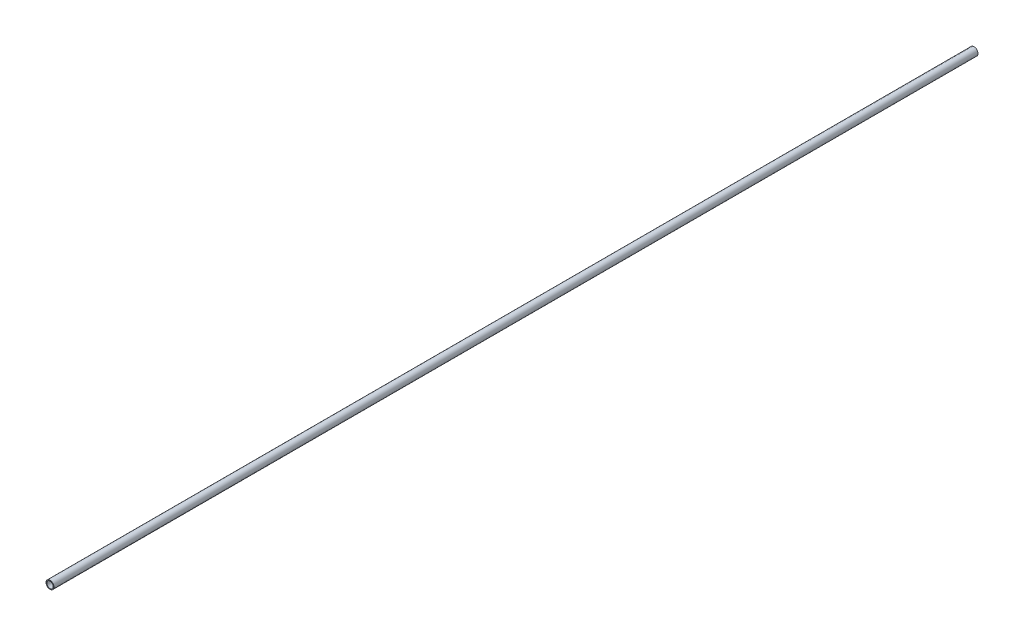
ISO-10303-21;
HEADER;
FILE_DESCRIPTION(('STEP AP214'),'2;1');
FILE_NAME('part.step','',(''),(''),'','','');
FILE_SCHEMA(('AUTOMOTIVE_DESIGN { 1 0 10303 214 1 1 1 1 }'));
ENDSEC;
DATA;
#1=APPLICATION_CONTEXT('core data for automotive mechanical design processes');
#2=APPLICATION_PROTOCOL_DEFINITION('international standard','automotive_design',2000,#1);
#3=PRODUCT_CONTEXT('',#1,'mechanical');
#4=PRODUCT('Part','Part','',(#3));
#5=PRODUCT_RELATED_PRODUCT_CATEGORY('part','',(#4));
#6=PRODUCT_DEFINITION_FORMATION('','',#4);
#7=PRODUCT_DEFINITION_CONTEXT('part definition',#1,'design');
#8=PRODUCT_DEFINITION('design','',#6,#7);
#9=PRODUCT_DEFINITION_SHAPE('','',#8);
#10=(LENGTH_UNIT() NAMED_UNIT(*) SI_UNIT(.MILLI.,.METRE.));
#11=(NAMED_UNIT(*) PLANE_ANGLE_UNIT() SI_UNIT($,.RADIAN.));
#12=(NAMED_UNIT(*) SI_UNIT($,.STERADIAN.) SOLID_ANGLE_UNIT());
#13=UNCERTAINTY_MEASURE_WITH_UNIT(LENGTH_MEASURE(1.E-05),#10,'distance_accuracy_value','');
#14=(GEOMETRIC_REPRESENTATION_CONTEXT(3) GLOBAL_UNCERTAINTY_ASSIGNED_CONTEXT((#13)) GLOBAL_UNIT_ASSIGNED_CONTEXT((#10,
#11,#12)) REPRESENTATION_CONTEXT('',''));
#15=CARTESIAN_POINT('',(0.,0.,0.));
#16=DIRECTION('',(0.,0.,1.));
#17=DIRECTION('',(1.,0.,0.));
#18=AXIS2_PLACEMENT_3D('',#15,#16,#17);
#19=CARTESIAN_POINT('',(0.,0.,1838.452));
#20=DIRECTION('',(0.,0.,1.));
#21=DIRECTION('',(1.,0.,0.));
#22=AXIS2_PLACEMENT_3D('',#19,#20,#21);
#23=PLANE('',#22);
#24=CARTESIAN_POINT('',(0.,0.,1838.452));
#25=DIRECTION('',(0.,0.,1.));
#26=DIRECTION('',(1.,0.,0.));
#27=AXIS2_PLACEMENT_3D('',#24,#25,#26);
#28=CIRCLE('',#27,7.874);
#29=CARTESIAN_POINT('',(7.874,0.,1838.452));
#30=VERTEX_POINT('',#29);
#31=EDGE_CURVE('E10',#30,#30,#28,.T.);
#32=ORIENTED_EDGE('',*,*,#31,.T.);
#33=EDGE_LOOP('',(#32));
#34=FACE_BOUND('',#33,.T.);
#35=CARTESIAN_POINT('',(0.,0.,1838.452));
#36=DIRECTION('',(0.,0.,1.));
#37=DIRECTION('',(1.,0.,0.));
#38=AXIS2_PLACEMENT_3D('',#35,#36,#37);
#39=CIRCLE('',#38,6.35);
#40=CARTESIAN_POINT('',(6.35,0.,1838.452));
#41=VERTEX_POINT('',#40);
#42=EDGE_CURVE('E42',#41,#41,#39,.T.);
#43=ORIENTED_EDGE('',*,*,#42,.F.);
#44=EDGE_LOOP('',(#43));
#45=FACE_BOUND('',#44,.T.);
#46=ADVANCED_FACE('F31',(#34,#45),#23,.T.);
#47=CARTESIAN_POINT('',(0.,0.,0.));
#48=DIRECTION('',(0.,0.,1.));
#49=DIRECTION('',(1.,0.,0.));
#50=AXIS2_PLACEMENT_3D('',#47,#48,#49);
#51=PLANE('',#50);
#52=CARTESIAN_POINT('',(0.,0.,0.));
#53=DIRECTION('',(0.,0.,1.));
#54=DIRECTION('',(1.,0.,0.));
#55=AXIS2_PLACEMENT_3D('',#52,#53,#54);
#56=CIRCLE('',#55,7.874);
#57=CARTESIAN_POINT('',(7.874,0.,0.));
#58=VERTEX_POINT('',#57);
#59=EDGE_CURVE('E35',#58,#58,#56,.T.);
#60=ORIENTED_EDGE('',*,*,#59,.F.);
#61=EDGE_LOOP('',(#60));
#62=FACE_BOUND('',#61,.T.);
#63=CARTESIAN_POINT('',(0.,0.,0.));
#64=DIRECTION('',(0.,0.,1.));
#65=DIRECTION('',(1.,0.,0.));
#66=AXIS2_PLACEMENT_3D('',#63,#64,#65);
#67=CIRCLE('',#66,6.35);
#68=CARTESIAN_POINT('',(6.35,0.,0.));
#69=VERTEX_POINT('',#68);
#70=EDGE_CURVE('E44',#69,#69,#67,.T.);
#71=ORIENTED_EDGE('',*,*,#70,.T.);
#72=EDGE_LOOP('',(#71));
#73=FACE_BOUND('',#72,.T.);
#74=ADVANCED_FACE('F54',(#62,#73),#51,.F.);
#75=CARTESIAN_POINT('',(0.,0.,1838.452));
#76=DIRECTION('',(0.,0.,-1.));
#77=DIRECTION('',(-1.,0.,0.));
#78=AXIS2_PLACEMENT_3D('',#75,#76,#77);
#79=CYLINDRICAL_SURFACE('',#78,7.874);
#80=ORIENTED_EDGE('',*,*,#31,.F.);
#81=EDGE_LOOP('',(#80));
#82=FACE_BOUND('',#81,.T.);
#83=ORIENTED_EDGE('',*,*,#59,.T.);
#84=EDGE_LOOP('',(#83));
#85=FACE_BOUND('',#84,.T.);
#86=ADVANCED_FACE('F33',(#82,#85),#79,.T.);
#87=CARTESIAN_POINT('',(0.,0.,1838.452));
#88=DIRECTION('',(0.,0.,-1.));
#89=DIRECTION('',(-1.,0.,0.));
#90=AXIS2_PLACEMENT_3D('',#87,#88,#89);
#91=CYLINDRICAL_SURFACE('',#90,6.35);
#92=ORIENTED_EDGE('',*,*,#42,.T.);
#93=EDGE_LOOP('',(#92));
#94=FACE_BOUND('',#93,.T.);
#95=ORIENTED_EDGE('',*,*,#70,.F.);
#96=EDGE_LOOP('',(#95));
#97=FACE_BOUND('',#96,.T.);
#98=ADVANCED_FACE('F50',(#94,#97),#91,.F.);
#99=CLOSED_SHELL('',(#46,#74,#86,#98));
#100=MANIFOLD_SOLID_BREP('B2',#99);
#101=ADVANCED_BREP_SHAPE_REPRESENTATION('',(#18,#100),#14);
#102=SHAPE_DEFINITION_REPRESENTATION(#9,#101);
ENDSEC;
END-ISO-10303-21;
